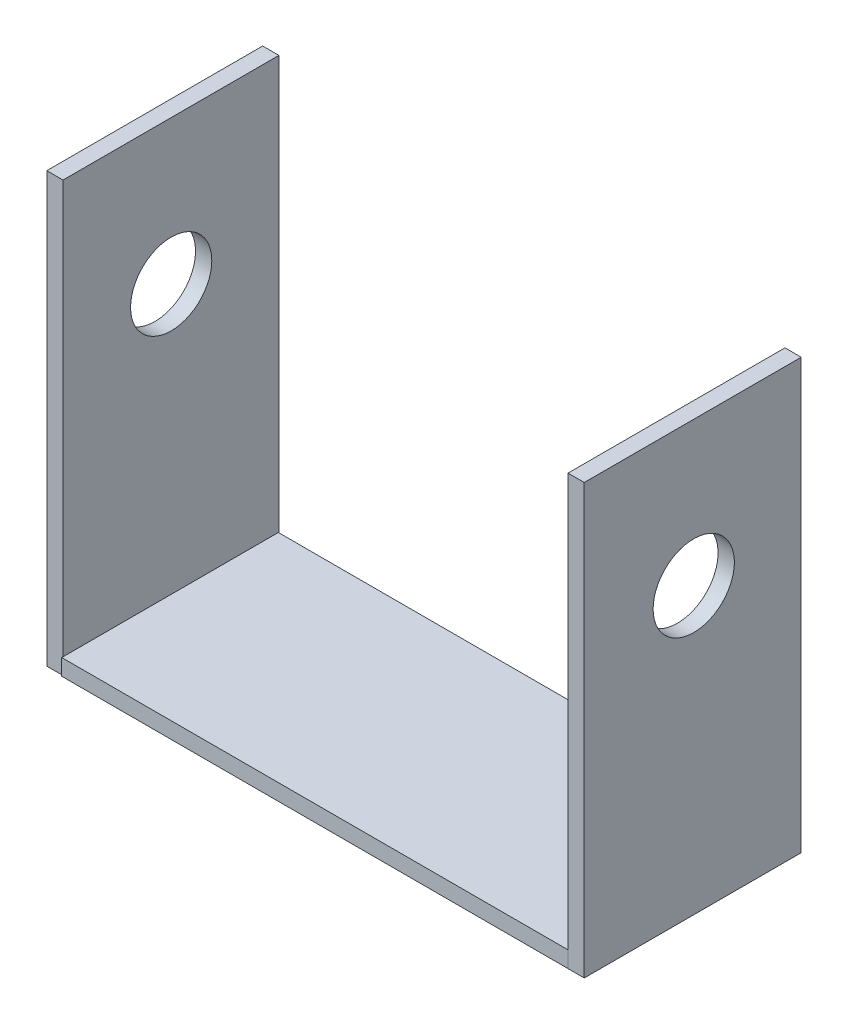
ISO-10303-21;
HEADER;
FILE_DESCRIPTION(('STEP AP214'),'2;1');
FILE_NAME('part.step','',(''),(''),'','','');
FILE_SCHEMA(('AUTOMOTIVE_DESIGN { 1 0 10303 214 1 1 1 1 }'));
ENDSEC;
DATA;
#1=APPLICATION_CONTEXT('core data for automotive mechanical design processes');
#2=APPLICATION_PROTOCOL_DEFINITION('international standard','automotive_design',2000,#1);
#3=PRODUCT_CONTEXT('',#1,'mechanical');
#4=PRODUCT('Part','Part','',(#3));
#5=PRODUCT_RELATED_PRODUCT_CATEGORY('part','',(#4));
#6=PRODUCT_DEFINITION_FORMATION('','',#4);
#7=PRODUCT_DEFINITION_CONTEXT('part definition',#1,'design');
#8=PRODUCT_DEFINITION('design','',#6,#7);
#9=PRODUCT_DEFINITION_SHAPE('','',#8);
#10=(LENGTH_UNIT() NAMED_UNIT(*) SI_UNIT(.MILLI.,.METRE.));
#11=(NAMED_UNIT(*) PLANE_ANGLE_UNIT() SI_UNIT($,.RADIAN.));
#12=(NAMED_UNIT(*) SI_UNIT($,.STERADIAN.) SOLID_ANGLE_UNIT());
#13=UNCERTAINTY_MEASURE_WITH_UNIT(LENGTH_MEASURE(1.E-05),#10,'distance_accuracy_value','');
#14=(GEOMETRIC_REPRESENTATION_CONTEXT(3) GLOBAL_UNCERTAINTY_ASSIGNED_CONTEXT((#13)) GLOBAL_UNIT_ASSIGNED_CONTEXT((#10,
#11,#12)) REPRESENTATION_CONTEXT('',''));
#15=CARTESIAN_POINT('',(0.,0.,0.));
#16=DIRECTION('',(0.,0.,1.));
#17=DIRECTION('',(1.,0.,0.));
#18=AXIS2_PLACEMENT_3D('',#15,#16,#17);
#19=CARTESIAN_POINT('',(-23.7617,1.524,-10.16));
#20=DIRECTION('',(0.,0.,1.));
#21=DIRECTION('',(1.,0.,0.));
#22=AXIS2_PLACEMENT_3D('',#19,#20,#21);
#23=PLANE('',#22);
#24=DIRECTION('',(-1.,0.,0.));
#25=VECTOR('',#24,1.);
#26=CARTESIAN_POINT('',(-23.7617,1.524,-10.16));
#27=LINE('',#26,#25);
#28=CARTESIAN_POINT('',(23.749,1.524,-10.16));
#29=VERTEX_POINT('',#28);
#30=CARTESIAN_POINT('',(-23.749,1.524,-10.16));
#31=VERTEX_POINT('',#30);
#32=EDGE_CURVE('E208',#29,#31,#27,.T.);
#33=ORIENTED_EDGE('',*,*,#32,.F.);
#34=DIRECTION('',(0.,-1.,0.));
#35=VECTOR('',#34,1.);
#36=CARTESIAN_POINT('',(23.749,1.524,-10.16));
#37=LINE('',#36,#35);
#38=CARTESIAN_POINT('',(23.749,0.,-10.16));
#39=VERTEX_POINT('',#38);
#40=EDGE_CURVE('E46',#29,#39,#37,.T.);
#41=ORIENTED_EDGE('',*,*,#40,.T.);
#42=DIRECTION('',(-1.,0.,0.));
#43=VECTOR('',#42,1.);
#44=CARTESIAN_POINT('',(-23.7617,0.,-10.16));
#45=LINE('',#44,#43);
#46=CARTESIAN_POINT('',(-23.749,0.,-10.16));
#47=VERTEX_POINT('',#46);
#48=EDGE_CURVE('E207',#39,#47,#45,.T.);
#49=ORIENTED_EDGE('',*,*,#48,.T.);
#50=DIRECTION('',(0.,1.,0.));
#51=VECTOR('',#50,1.);
#52=CARTESIAN_POINT('',(-23.749,1.524,-10.16));
#53=LINE('',#52,#51);
#54=EDGE_CURVE('E198',#47,#31,#53,.T.);
#55=ORIENTED_EDGE('',*,*,#54,.T.);
#56=EDGE_LOOP('',(#33,#41,#49,#55));
#57=FACE_BOUND('',#56,.T.);
#58=ADVANCED_FACE('F32',(#57),#23,.F.);
#59=CARTESIAN_POINT('',(-23.7617,1.524,10.16));
#60=DIRECTION('',(1.,0.,0.));
#61=DIRECTION('',(0.,0.,-1.));
#62=AXIS2_PLACEMENT_3D('',#59,#60,#61);
#63=PLANE('',#62);
#64=DIRECTION('',(0.,0.,1.));
#65=VECTOR('',#64,1.);
#66=CARTESIAN_POINT('',(-23.7617,1.524,10.16));
#67=LINE('',#66,#65);
#68=CARTESIAN_POINT('',(-23.7617,1.524,10.0390885231576));
#69=VERTEX_POINT('',#68);
#70=CARTESIAN_POINT('',(-23.7617,1.524,10.16));
#71=VERTEX_POINT('',#70);
#72=EDGE_CURVE('E210',#69,#71,#67,.T.);
#73=ORIENTED_EDGE('',*,*,#72,.F.);
#74=DIRECTION('',(0.,-1.,0.));
#75=VECTOR('',#74,1.);
#76=CARTESIAN_POINT('',(-23.7617,1.524,10.0390885231576));
#77=LINE('',#76,#75);
#78=CARTESIAN_POINT('',(-23.7617,0.,10.0390885231576));
#79=VERTEX_POINT('',#78);
#80=EDGE_CURVE('E204',#69,#79,#77,.T.);
#81=ORIENTED_EDGE('',*,*,#80,.T.);
#82=DIRECTION('',(0.,0.,1.));
#83=VECTOR('',#82,1.);
#84=CARTESIAN_POINT('',(-23.7617,0.,10.16));
#85=LINE('',#84,#83);
#86=CARTESIAN_POINT('',(-23.7617,0.,10.16));
#87=VERTEX_POINT('',#86);
#88=EDGE_CURVE('E216',#79,#87,#85,.T.);
#89=ORIENTED_EDGE('',*,*,#88,.T.);
#90=DIRECTION('',(0.,-1.,0.));
#91=VECTOR('',#90,1.);
#92=CARTESIAN_POINT('',(-23.7617,1.524,10.16));
#93=LINE('',#92,#91);
#94=EDGE_CURVE('E11',#71,#87,#93,.T.);
#95=ORIENTED_EDGE('',*,*,#94,.F.);
#96=EDGE_LOOP('',(#73,#81,#89,#95));
#97=FACE_BOUND('',#96,.T.);
#98=ADVANCED_FACE('F263',(#97),#63,.F.);
#99=CARTESIAN_POINT('',(-23.7617,1.524,10.16));
#100=DIRECTION('',(0.,0.,-1.));
#101=DIRECTION('',(-1.,0.,0.));
#102=AXIS2_PLACEMENT_3D('',#99,#100,#101);
#103=PLANE('',#102);
#104=DIRECTION('',(1.,0.,0.));
#105=VECTOR('',#104,1.);
#106=CARTESIAN_POINT('',(-23.7617,0.,10.16));
#107=LINE('',#106,#105);
#108=CARTESIAN_POINT('',(23.749,0.,10.16));
#109=VERTEX_POINT('',#108);
#110=EDGE_CURVE('E211',#87,#109,#107,.T.);
#111=ORIENTED_EDGE('',*,*,#110,.T.);
#112=DIRECTION('',(0.,1.,0.));
#113=VECTOR('',#112,1.);
#114=CARTESIAN_POINT('',(23.749,1.524,10.16));
#115=LINE('',#114,#113);
#116=CARTESIAN_POINT('',(23.749,1.524,10.16));
#117=VERTEX_POINT('',#116);
#118=EDGE_CURVE('E157',#109,#117,#115,.T.);
#119=ORIENTED_EDGE('',*,*,#118,.T.);
#120=DIRECTION('',(1.,0.,0.));
#121=VECTOR('',#120,1.);
#122=CARTESIAN_POINT('',(-23.7617,1.524,10.16));
#123=LINE('',#122,#121);
#124=EDGE_CURVE('E39',#71,#117,#123,.T.);
#125=ORIENTED_EDGE('',*,*,#124,.F.);
#126=ORIENTED_EDGE('',*,*,#94,.T.);
#127=EDGE_LOOP('',(#111,#119,#125,#126));
#128=FACE_BOUND('',#127,.T.);
#129=ADVANCED_FACE('F220',(#128),#103,.F.);
#130=CARTESIAN_POINT('',(0.,1.524,0.));
#131=DIRECTION('',(0.,-1.,0.));
#132=DIRECTION('',(0.,0.,-1.));
#133=AXIS2_PLACEMENT_3D('',#130,#131,#132);
#134=PLANE('',#133);
#135=ORIENTED_EDGE('',*,*,#124,.T.);
#136=DIRECTION('',(0.,0.,-1.));
#137=VECTOR('',#136,1.);
#138=CARTESIAN_POINT('',(23.749,1.524,0.));
#139=LINE('',#138,#137);
#140=EDGE_CURVE('E155',#117,#29,#139,.T.);
#141=ORIENTED_EDGE('',*,*,#140,.T.);
#142=ORIENTED_EDGE('',*,*,#32,.T.);
#143=DIRECTION('',(0.,0.,1.));
#144=VECTOR('',#143,1.);
#145=CARTESIAN_POINT('',(-23.749,1.524,0.));
#146=LINE('',#145,#144);
#147=CARTESIAN_POINT('',(-23.749,1.524,10.0390885231576));
#148=VERTEX_POINT('',#147);
#149=EDGE_CURVE('E190',#31,#148,#146,.T.);
#150=ORIENTED_EDGE('',*,*,#149,.T.);
#151=DIRECTION('',(-1.,0.,0.));
#152=VECTOR('',#151,1.);
#153=CARTESIAN_POINT('',(0.,1.524,10.0390885231576));
#154=LINE('',#153,#152);
#155=EDGE_CURVE('E201',#148,#69,#154,.T.);
#156=ORIENTED_EDGE('',*,*,#155,.T.);
#157=ORIENTED_EDGE('',*,*,#72,.T.);
#158=EDGE_LOOP('',(#135,#141,#142,#150,#156,#157));
#159=FACE_BOUND('',#158,.T.);
#160=ADVANCED_FACE('F272',(#159),#134,.F.);
#161=CARTESIAN_POINT('',(0.,0.,0.));
#162=DIRECTION('',(0.,-1.,0.));
#163=DIRECTION('',(0.,0.,-1.));
#164=AXIS2_PLACEMENT_3D('',#161,#162,#163);
#165=PLANE('',#164);
#166=ORIENTED_EDGE('',*,*,#48,.F.);
#167=DIRECTION('',(0.,0.,-1.));
#168=VECTOR('',#167,1.);
#169=CARTESIAN_POINT('',(23.749,0.,10.1629301873558));
#170=LINE('',#169,#168);
#171=CARTESIAN_POINT('',(23.749,0.,-10.1926258157583));
#172=VERTEX_POINT('',#171);
#173=EDGE_CURVE('E226',#39,#172,#170,.T.);
#174=ORIENTED_EDGE('',*,*,#173,.T.);
#175=DIRECTION('',(-1.,0.,0.));
#176=VECTOR('',#175,1.);
#177=CARTESIAN_POINT('',(25.273,0.,-10.1926258157583));
#178=LINE('',#177,#176);
#179=CARTESIAN_POINT('',(25.273,0.,-10.1926258157583));
#180=VERTEX_POINT('',#179);
#181=EDGE_CURVE('E137',#180,#172,#178,.T.);
#182=ORIENTED_EDGE('',*,*,#181,.F.);
#183=DIRECTION('',(0.,0.,-1.));
#184=VECTOR('',#183,1.);
#185=CARTESIAN_POINT('',(25.273,0.,10.1629301873558));
#186=LINE('',#185,#184);
#187=CARTESIAN_POINT('',(25.273,0.,10.1629301873558));
#188=VERTEX_POINT('',#187);
#189=EDGE_CURVE('E128',#188,#180,#186,.T.);
#190=ORIENTED_EDGE('',*,*,#189,.F.);
#191=DIRECTION('',(-1.,0.,0.));
#192=VECTOR('',#191,1.);
#193=CARTESIAN_POINT('',(25.273,0.,10.1629301873558));
#194=LINE('',#193,#192);
#195=CARTESIAN_POINT('',(23.749,0.,10.1629301873558));
#196=VERTEX_POINT('',#195);
#197=EDGE_CURVE('E134',#188,#196,#194,.T.);
#198=ORIENTED_EDGE('',*,*,#197,.T.);
#199=EDGE_CURVE('E224',#196,#109,#170,.T.);
#200=ORIENTED_EDGE('',*,*,#199,.T.);
#201=ORIENTED_EDGE('',*,*,#110,.F.);
#202=ORIENTED_EDGE('',*,*,#88,.F.);
#203=DIRECTION('',(1.,0.,0.));
#204=VECTOR('',#203,1.);
#205=CARTESIAN_POINT('',(-25.273,0.,10.0390885231576));
#206=LINE('',#205,#204);
#207=CARTESIAN_POINT('',(-25.273,0.,10.0390885231576));
#208=VERTEX_POINT('',#207);
#209=EDGE_CURVE('E191',#208,#79,#206,.T.);
#210=ORIENTED_EDGE('',*,*,#209,.F.);
#211=DIRECTION('',(0.,0.,-1.));
#212=VECTOR('',#211,1.);
#213=CARTESIAN_POINT('',(-25.273,0.,-10.2149229179282));
#214=LINE('',#213,#212);
#215=CARTESIAN_POINT('',(-25.273,0.,-10.2149229179282));
#216=VERTEX_POINT('',#215);
#217=EDGE_CURVE('E177',#208,#216,#214,.T.);
#218=ORIENTED_EDGE('',*,*,#217,.T.);
#219=DIRECTION('',(1.,0.,0.));
#220=VECTOR('',#219,1.);
#221=CARTESIAN_POINT('',(-25.273,0.,-10.2149229179282));
#222=LINE('',#221,#220);
#223=CARTESIAN_POINT('',(-23.749,0.,-10.2149229179282));
#224=VERTEX_POINT('',#223);
#225=EDGE_CURVE('E187',#216,#224,#222,.T.);
#226=ORIENTED_EDGE('',*,*,#225,.T.);
#227=DIRECTION('',(0.,0.,-1.));
#228=VECTOR('',#227,1.);
#229=CARTESIAN_POINT('',(-23.749,0.,-10.2149229179282));
#230=LINE('',#229,#228);
#231=EDGE_CURVE('E171',#47,#224,#230,.T.);
#232=ORIENTED_EDGE('',*,*,#231,.F.);
#233=EDGE_LOOP('',(#166,#174,#182,#190,#198,#200,#201,#202,#210,#218,#226,#232));
#234=FACE_BOUND('',#233,.T.);
#235=ADVANCED_FACE('F131',(#234),#165,.T.);
#236=CARTESIAN_POINT('',(-25.273,0.,10.0390885231576));
#237=DIRECTION('',(0.,0.,1.));
#238=DIRECTION('',(1.,0.,0.));
#239=AXIS2_PLACEMENT_3D('',#236,#237,#238);
#240=PLANE('',#239);
#241=ORIENTED_EDGE('',*,*,#80,.F.);
#242=ORIENTED_EDGE('',*,*,#155,.F.);
#243=DIRECTION('',(0.,-1.,0.));
#244=VECTOR('',#243,1.);
#245=CARTESIAN_POINT('',(-23.749,0.,10.0390885231576));
#246=LINE('',#245,#244);
#247=CARTESIAN_POINT('',(-23.749,40.259,10.0390885231576));
#248=VERTEX_POINT('',#247);
#249=EDGE_CURVE('E54',#248,#148,#246,.T.);
#250=ORIENTED_EDGE('',*,*,#249,.F.);
#251=DIRECTION('',(1.,0.,0.));
#252=VECTOR('',#251,1.);
#253=CARTESIAN_POINT('',(-25.273,40.259,10.0390885231576));
#254=LINE('',#253,#252);
#255=CARTESIAN_POINT('',(-25.273,40.259,10.0390885231576));
#256=VERTEX_POINT('',#255);
#257=EDGE_CURVE('E193',#256,#248,#254,.T.);
#258=ORIENTED_EDGE('',*,*,#257,.F.);
#259=DIRECTION('',(0.,-1.,0.));
#260=VECTOR('',#259,1.);
#261=CARTESIAN_POINT('',(-25.273,0.,10.0390885231576));
#262=LINE('',#261,#260);
#263=EDGE_CURVE('E174',#256,#208,#262,.T.);
#264=ORIENTED_EDGE('',*,*,#263,.T.);
#265=ORIENTED_EDGE('',*,*,#209,.T.);
#266=EDGE_LOOP('',(#241,#242,#250,#258,#264,#265));
#267=FACE_BOUND('',#266,.T.);
#268=ADVANCED_FACE('F286',(#267),#240,.T.);
#269=CARTESIAN_POINT('',(-23.749,0.,0.));
#270=DIRECTION('',(1.,0.,0.));
#271=DIRECTION('',(0.,0.,-1.));
#272=AXIS2_PLACEMENT_3D('',#269,#270,#271);
#273=PLANE('',#272);
#274=CARTESIAN_POINT('',(-23.749,26.7387754074422,-0.107211081481529));
#275=DIRECTION('',(1.,0.,0.));
#276=DIRECTION('',(0.,0.,-1.));
#277=AXIS2_PLACEMENT_3D('',#274,#275,#276);
#278=CIRCLE('',#277,3.81);
#279=CARTESIAN_POINT('',(-23.749,26.7387754074422,-3.91721108148153));
#280=VERTEX_POINT('',#279);
#281=EDGE_CURVE('E242',#280,#280,#278,.T.);
#282=ORIENTED_EDGE('',*,*,#281,.F.);
#283=EDGE_LOOP('',(#282));
#284=FACE_BOUND('',#283,.T.);
#285=ORIENTED_EDGE('',*,*,#54,.F.);
#286=ORIENTED_EDGE('',*,*,#231,.T.);
#287=DIRECTION('',(0.,1.,0.));
#288=VECTOR('',#287,1.);
#289=CARTESIAN_POINT('',(-23.749,0.,-10.2149229179282));
#290=LINE('',#289,#288);
#291=CARTESIAN_POINT('',(-23.749,40.259,-10.2149229179282));
#292=VERTEX_POINT('',#291);
#293=EDGE_CURVE('E166',#224,#292,#290,.T.);
#294=ORIENTED_EDGE('',*,*,#293,.T.);
#295=DIRECTION('',(0.,0.,1.));
#296=VECTOR('',#295,1.);
#297=CARTESIAN_POINT('',(-23.749,40.259,-10.2149229179282));
#298=LINE('',#297,#296);
#299=EDGE_CURVE('E183',#292,#248,#298,.T.);
#300=ORIENTED_EDGE('',*,*,#299,.T.);
#301=ORIENTED_EDGE('',*,*,#249,.T.);
#302=ORIENTED_EDGE('',*,*,#149,.F.);
#303=EDGE_LOOP('',(#285,#286,#294,#300,#301,#302));
#304=FACE_BOUND('',#303,.T.);
#305=ADVANCED_FACE('F273',(#284,#304),#273,.T.);
#306=CARTESIAN_POINT('',(-25.273,0.,-10.2149229179282));
#307=DIRECTION('',(0.,0.,-1.));
#308=DIRECTION('',(-1.,0.,0.));
#309=AXIS2_PLACEMENT_3D('',#306,#307,#308);
#310=PLANE('',#309);
#311=ORIENTED_EDGE('',*,*,#293,.F.);
#312=ORIENTED_EDGE('',*,*,#225,.F.);
#313=DIRECTION('',(0.,1.,0.));
#314=VECTOR('',#313,1.);
#315=CARTESIAN_POINT('',(-25.273,0.,-10.2149229179282));
#316=LINE('',#315,#314);
#317=CARTESIAN_POINT('',(-25.273,40.259,-10.2149229179282));
#318=VERTEX_POINT('',#317);
#319=EDGE_CURVE('E167',#216,#318,#316,.T.);
#320=ORIENTED_EDGE('',*,*,#319,.T.);
#321=DIRECTION('',(1.,0.,0.));
#322=VECTOR('',#321,1.);
#323=CARTESIAN_POINT('',(-25.273,40.259,-10.2149229179282));
#324=LINE('',#323,#322);
#325=EDGE_CURVE('E180',#318,#292,#324,.T.);
#326=ORIENTED_EDGE('',*,*,#325,.T.);
#327=EDGE_LOOP('',(#311,#312,#320,#326));
#328=FACE_BOUND('',#327,.T.);
#329=ADVANCED_FACE('F279',(#328),#310,.T.);
#330=CARTESIAN_POINT('',(-25.273,40.259,-10.2149229179282));
#331=DIRECTION('',(0.,1.,0.));
#332=DIRECTION('',(0.,0.,1.));
#333=AXIS2_PLACEMENT_3D('',#330,#331,#332);
#334=PLANE('',#333);
#335=ORIENTED_EDGE('',*,*,#299,.F.);
#336=ORIENTED_EDGE('',*,*,#325,.F.);
#337=DIRECTION('',(0.,0.,1.));
#338=VECTOR('',#337,1.);
#339=CARTESIAN_POINT('',(-25.273,40.259,-10.2149229179282));
#340=LINE('',#339,#338);
#341=EDGE_CURVE('E170',#318,#256,#340,.T.);
#342=ORIENTED_EDGE('',*,*,#341,.T.);
#343=ORIENTED_EDGE('',*,*,#257,.T.);
#344=EDGE_LOOP('',(#335,#336,#342,#343));
#345=FACE_BOUND('',#344,.T.);
#346=ADVANCED_FACE('F282',(#345),#334,.T.);
#347=CARTESIAN_POINT('',(-25.273,0.,0.));
#348=DIRECTION('',(1.,0.,0.));
#349=DIRECTION('',(0.,0.,-1.));
#350=AXIS2_PLACEMENT_3D('',#347,#348,#349);
#351=PLANE('',#350);
#352=CARTESIAN_POINT('',(-25.273,26.7387754074422,-0.107211081481529));
#353=DIRECTION('',(-1.,0.,0.));
#354=DIRECTION('',(0.,0.,1.));
#355=AXIS2_PLACEMENT_3D('',#352,#353,#354);
#356=CIRCLE('',#355,3.81);
#357=CARTESIAN_POINT('',(-25.273,26.7387754074422,3.70278891851847));
#358=VERTEX_POINT('',#357);
#359=EDGE_CURVE('E401',#358,#358,#356,.T.);
#360=ORIENTED_EDGE('',*,*,#359,.F.);
#361=EDGE_LOOP('',(#360));
#362=FACE_BOUND('',#361,.T.);
#363=ORIENTED_EDGE('',*,*,#319,.F.);
#364=ORIENTED_EDGE('',*,*,#217,.F.);
#365=ORIENTED_EDGE('',*,*,#263,.F.);
#366=ORIENTED_EDGE('',*,*,#341,.F.);
#367=EDGE_LOOP('',(#363,#364,#365,#366));
#368=FACE_BOUND('',#367,.T.);
#369=ADVANCED_FACE('F289',(#362,#368),#351,.F.);
#370=CARTESIAN_POINT('',(23.749,0.,0.));
#371=DIRECTION('',(-1.,0.,0.));
#372=DIRECTION('',(0.,0.,1.));
#373=AXIS2_PLACEMENT_3D('',#370,#371,#372);
#374=PLANE('',#373);
#375=CARTESIAN_POINT('',(23.749,26.7387754074422,-0.107211081481529));
#376=DIRECTION('',(-1.,0.,0.));
#377=DIRECTION('',(0.,0.,1.));
#378=AXIS2_PLACEMENT_3D('',#375,#376,#377);
#379=CIRCLE('',#378,3.81);
#380=CARTESIAN_POINT('',(23.749,26.7387754074422,3.70278891851847));
#381=VERTEX_POINT('',#380);
#382=EDGE_CURVE('E244',#381,#381,#379,.T.);
#383=ORIENTED_EDGE('',*,*,#382,.F.);
#384=EDGE_LOOP('',(#383));
#385=FACE_BOUND('',#384,.T.);
#386=ORIENTED_EDGE('',*,*,#40,.F.);
#387=ORIENTED_EDGE('',*,*,#140,.F.);
#388=ORIENTED_EDGE('',*,*,#118,.F.);
#389=ORIENTED_EDGE('',*,*,#199,.F.);
#390=DIRECTION('',(0.,-1.,0.));
#391=VECTOR('',#390,1.);
#392=CARTESIAN_POINT('',(23.749,0.,10.1629301873558));
#393=LINE('',#392,#391);
#394=CARTESIAN_POINT('',(23.749,40.259,10.1629301873558));
#395=VERTEX_POINT('',#394);
#396=EDGE_CURVE('E154',#395,#196,#393,.T.);
#397=ORIENTED_EDGE('',*,*,#396,.F.);
#398=DIRECTION('',(0.,0.,1.));
#399=VECTOR('',#398,1.);
#400=CARTESIAN_POINT('',(23.749,40.259,10.1629301873558));
#401=LINE('',#400,#399);
#402=CARTESIAN_POINT('',(23.749,40.259,-10.1926258157583));
#403=VERTEX_POINT('',#402);
#404=EDGE_CURVE('E150',#403,#395,#401,.T.);
#405=ORIENTED_EDGE('',*,*,#404,.F.);
#406=DIRECTION('',(0.,1.,0.));
#407=VECTOR('',#406,1.);
#408=CARTESIAN_POINT('',(23.749,0.,-10.1926258157583));
#409=LINE('',#408,#407);
#410=EDGE_CURVE('E225',#172,#403,#409,.T.);
#411=ORIENTED_EDGE('',*,*,#410,.F.);
#412=ORIENTED_EDGE('',*,*,#173,.F.);
#413=EDGE_LOOP('',(#386,#387,#388,#389,#397,#405,#411,#412));
#414=FACE_BOUND('',#413,.T.);
#415=ADVANCED_FACE('F241',(#385,#414),#374,.T.);
#416=CARTESIAN_POINT('',(25.273,0.,10.1629301873558));
#417=DIRECTION('',(0.,0.,-1.));
#418=DIRECTION('',(-1.,0.,0.));
#419=AXIS2_PLACEMENT_3D('',#416,#417,#418);
#420=PLANE('',#419);
#421=ORIENTED_EDGE('',*,*,#396,.T.);
#422=ORIENTED_EDGE('',*,*,#197,.F.);
#423=DIRECTION('',(0.,-1.,0.));
#424=VECTOR('',#423,1.);
#425=CARTESIAN_POINT('',(25.273,0.,10.1629301873558));
#426=LINE('',#425,#424);
#427=CARTESIAN_POINT('',(25.273,40.259,10.1629301873558));
#428=VERTEX_POINT('',#427);
#429=EDGE_CURVE('E141',#428,#188,#426,.T.);
#430=ORIENTED_EDGE('',*,*,#429,.F.);
#431=DIRECTION('',(-1.,0.,0.));
#432=VECTOR('',#431,1.);
#433=CARTESIAN_POINT('',(25.273,40.259,10.1629301873558));
#434=LINE('',#433,#432);
#435=EDGE_CURVE('E233',#428,#395,#434,.T.);
#436=ORIENTED_EDGE('',*,*,#435,.T.);
#437=EDGE_LOOP('',(#421,#422,#430,#436));
#438=FACE_BOUND('',#437,.T.);
#439=ADVANCED_FACE('F152',(#438),#420,.F.);
#440=CARTESIAN_POINT('',(25.273,0.,-10.1926258157583));
#441=DIRECTION('',(0.,0.,1.));
#442=DIRECTION('',(1.,0.,0.));
#443=AXIS2_PLACEMENT_3D('',#440,#441,#442);
#444=PLANE('',#443);
#445=ORIENTED_EDGE('',*,*,#410,.T.);
#446=DIRECTION('',(-1.,0.,0.));
#447=VECTOR('',#446,1.);
#448=CARTESIAN_POINT('',(25.273,40.259,-10.1926258157583));
#449=LINE('',#448,#447);
#450=CARTESIAN_POINT('',(25.273,40.259,-10.1926258157583));
#451=VERTEX_POINT('',#450);
#452=EDGE_CURVE('E159',#451,#403,#449,.T.);
#453=ORIENTED_EDGE('',*,*,#452,.F.);
#454=DIRECTION('',(0.,1.,0.));
#455=VECTOR('',#454,1.);
#456=CARTESIAN_POINT('',(25.273,0.,-10.1926258157583));
#457=LINE('',#456,#455);
#458=EDGE_CURVE('E140',#180,#451,#457,.T.);
#459=ORIENTED_EDGE('',*,*,#458,.F.);
#460=ORIENTED_EDGE('',*,*,#181,.T.);
#461=EDGE_LOOP('',(#445,#453,#459,#460));
#462=FACE_BOUND('',#461,.T.);
#463=ADVANCED_FACE('F253',(#462),#444,.F.);
#464=CARTESIAN_POINT('',(25.273,40.259,10.1629301873558));
#465=DIRECTION('',(0.,-1.,0.));
#466=DIRECTION('',(0.,0.,-1.));
#467=AXIS2_PLACEMENT_3D('',#464,#465,#466);
#468=PLANE('',#467);
#469=ORIENTED_EDGE('',*,*,#404,.T.);
#470=ORIENTED_EDGE('',*,*,#435,.F.);
#471=DIRECTION('',(0.,0.,1.));
#472=VECTOR('',#471,1.);
#473=CARTESIAN_POINT('',(25.273,40.259,10.1629301873558));
#474=LINE('',#473,#472);
#475=EDGE_CURVE('E146',#451,#428,#474,.T.);
#476=ORIENTED_EDGE('',*,*,#475,.F.);
#477=ORIENTED_EDGE('',*,*,#452,.T.);
#478=EDGE_LOOP('',(#469,#470,#476,#477));
#479=FACE_BOUND('',#478,.T.);
#480=ADVANCED_FACE('F238',(#479),#468,.F.);
#481=CARTESIAN_POINT('',(25.273,0.,0.));
#482=DIRECTION('',(-1.,0.,0.));
#483=DIRECTION('',(0.,0.,1.));
#484=AXIS2_PLACEMENT_3D('',#481,#482,#483);
#485=PLANE('',#484);
#486=CARTESIAN_POINT('',(25.273,26.7387754074422,-0.107211081481529));
#487=DIRECTION('',(-1.,0.,0.));
#488=DIRECTION('',(0.,0.,1.));
#489=AXIS2_PLACEMENT_3D('',#486,#487,#488);
#490=CIRCLE('',#489,3.81);
#491=CARTESIAN_POINT('',(25.273,26.7387754074422,3.70278891851847));
#492=VERTEX_POINT('',#491);
#493=EDGE_CURVE('E249',#492,#492,#490,.T.);
#494=ORIENTED_EDGE('',*,*,#493,.T.);
#495=EDGE_LOOP('',(#494));
#496=FACE_BOUND('',#495,.T.);
#497=ORIENTED_EDGE('',*,*,#429,.T.);
#498=ORIENTED_EDGE('',*,*,#189,.T.);
#499=ORIENTED_EDGE('',*,*,#458,.T.);
#500=ORIENTED_EDGE('',*,*,#475,.T.);
#501=EDGE_LOOP('',(#497,#498,#499,#500));
#502=FACE_BOUND('',#501,.T.);
#503=ADVANCED_FACE('F144',(#496,#502),#485,.F.);
#504=CARTESIAN_POINT('',(25.273,26.7387754074422,-0.107211081481529));
#505=DIRECTION('',(-1.,0.,0.));
#506=DIRECTION('',(0.,0.,1.));
#507=AXIS2_PLACEMENT_3D('',#504,#505,#506);
#508=CYLINDRICAL_SURFACE('',#507,3.81);
#509=ORIENTED_EDGE('',*,*,#382,.T.);
#510=EDGE_LOOP('',(#509));
#511=FACE_BOUND('',#510,.T.);
#512=ORIENTED_EDGE('',*,*,#493,.F.);
#513=EDGE_LOOP('',(#512));
#514=FACE_BOUND('',#513,.T.);
#515=ADVANCED_FACE('F377',(#511,#514),#508,.F.);
#516=ORIENTED_EDGE('',*,*,#281,.T.);
#517=EDGE_LOOP('',(#516));
#518=FACE_BOUND('',#517,.T.);
#519=ORIENTED_EDGE('',*,*,#359,.T.);
#520=EDGE_LOOP('',(#519));
#521=FACE_BOUND('',#520,.T.);
#522=ADVANCED_FACE('F387',(#518,#521),#508,.F.);
#523=CLOSED_SHELL('',(#58,#98,#129,#160,#235,#268,#305,#329,#346,#369,#415,#439,#463,#480,#503,
#515,#522));
#524=MANIFOLD_SOLID_BREP('B2',#523);
#525=ADVANCED_BREP_SHAPE_REPRESENTATION('',(#18,#524),#14);
#526=SHAPE_DEFINITION_REPRESENTATION(#9,#525);
ENDSEC;
END-ISO-10303-21;
